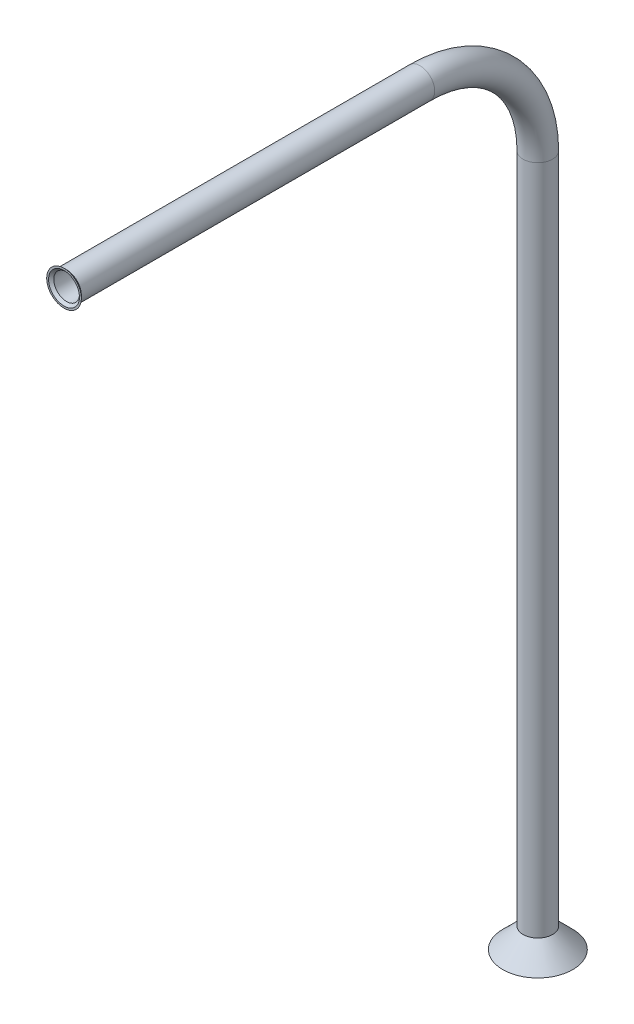
ISO-10303-21;
HEADER;
FILE_DESCRIPTION(('STEP AP214'),'2;1');
FILE_NAME('part.step','',(''),(''),'','','');
FILE_SCHEMA(('AUTOMOTIVE_DESIGN { 1 0 10303 214 1 1 1 1 }'));
ENDSEC;
DATA;
#1=APPLICATION_CONTEXT('core data for automotive mechanical design processes');
#2=APPLICATION_PROTOCOL_DEFINITION('international standard','automotive_design',2000,#1);
#3=PRODUCT_CONTEXT('',#1,'mechanical');
#4=PRODUCT('Part','Part','',(#3));
#5=PRODUCT_RELATED_PRODUCT_CATEGORY('part','',(#4));
#6=PRODUCT_DEFINITION_FORMATION('','',#4);
#7=PRODUCT_DEFINITION_CONTEXT('part definition',#1,'design');
#8=PRODUCT_DEFINITION('design','',#6,#7);
#9=PRODUCT_DEFINITION_SHAPE('','',#8);
#10=(LENGTH_UNIT() NAMED_UNIT(*) SI_UNIT(.MILLI.,.METRE.));
#11=(NAMED_UNIT(*) PLANE_ANGLE_UNIT() SI_UNIT($,.RADIAN.));
#12=(NAMED_UNIT(*) SI_UNIT($,.STERADIAN.) SOLID_ANGLE_UNIT());
#13=UNCERTAINTY_MEASURE_WITH_UNIT(LENGTH_MEASURE(1.E-05),#10,'distance_accuracy_value','');
#14=(GEOMETRIC_REPRESENTATION_CONTEXT(3) GLOBAL_UNCERTAINTY_ASSIGNED_CONTEXT((#13)) GLOBAL_UNIT_ASSIGNED_CONTEXT((#10,
#11,#12)) REPRESENTATION_CONTEXT('',''));
#15=CARTESIAN_POINT('',(0.,0.,0.));
#16=DIRECTION('',(0.,0.,1.));
#17=DIRECTION('',(1.,0.,0.));
#18=AXIS2_PLACEMENT_3D('',#15,#16,#17);
#19=CARTESIAN_POINT('',(0.,0.,0.));
#20=DIRECTION('',(0.,0.,-1.));
#21=DIRECTION('',(-1.,0.,0.));
#22=AXIS2_PLACEMENT_3D('',#19,#20,#21);
#23=CYLINDRICAL_SURFACE('',#22,6.35);
#24=CARTESIAN_POINT('',(0.,0.,-152.4));
#25=DIRECTION('',(0.,0.,1.));
#26=DIRECTION('',(1.,0.,0.));
#27=AXIS2_PLACEMENT_3D('',#24,#25,#26);
#28=CIRCLE('',#27,6.35);
#29=CARTESIAN_POINT('',(0.,6.35000000000002,-152.4));
#30=VERTEX_POINT('',#29);
#31=EDGE_CURVE('E65',#30,#30,#28,.T.);
#32=ORIENTED_EDGE('',*,*,#31,.T.);
#33=EDGE_LOOP('',(#32));
#34=FACE_BOUND('',#33,.T.);
#35=CARTESIAN_POINT('',(0.,0.,0.));
#36=DIRECTION('',(0.,0.,1.));
#37=DIRECTION('',(1.,0.,0.));
#38=AXIS2_PLACEMENT_3D('',#35,#36,#37);
#39=CIRCLE('',#38,6.35);
#40=CARTESIAN_POINT('',(6.35,0.,0.));
#41=VERTEX_POINT('',#40);
#42=EDGE_CURVE('E72',#41,#41,#39,.T.);
#43=ORIENTED_EDGE('',*,*,#42,.F.);
#44=EDGE_LOOP('',(#43));
#45=FACE_BOUND('',#44,.T.);
#46=ADVANCED_FACE('F48',(#34,#45),#23,.T.);
#47=CARTESIAN_POINT('',(0.,-50.8,-152.4));
#48=DIRECTION('',(-1.,0.,0.));
#49=DIRECTION('',(0.,0.,1.));
#50=AXIS2_PLACEMENT_3D('',#47,#48,#49);
#51=TOROIDAL_SURFACE('',#50,50.8,6.35);
#52=CARTESIAN_POINT('',(0.,-50.8,-203.2));
#53=DIRECTION('',(0.,1.,0.));
#54=DIRECTION('',(1.,0.,0.));
#55=AXIS2_PLACEMENT_3D('',#52,#53,#54);
#56=CIRCLE('',#55,6.35);
#57=CARTESIAN_POINT('',(0.,-50.8,-209.55));
#58=VERTEX_POINT('',#57);
#59=EDGE_CURVE('E69',#58,#58,#56,.T.);
#60=CARTESIAN_POINT('',(0.,-50.8,-152.4));
#61=DIRECTION('',(-1.,0.,0.));
#62=DIRECTION('',(0.,0.,1.));
#63=AXIS2_PLACEMENT_3D('',#60,#61,#62);
#64=CIRCLE('',#63,57.15);
#65=EDGE_CURVE('',#30,#58,#64,.T.);
#66=ORIENTED_EDGE('',*,*,#31,.F.);
#67=ORIENTED_EDGE('',*,*,#59,.T.);
#68=ORIENTED_EDGE('',*,*,#65,.T.);
#69=ORIENTED_EDGE('',*,*,#65,.F.);
#70=EDGE_LOOP('',(#66,#68,#67,#69));
#71=FACE_BOUND('',#70,.T.);
#72=ADVANCED_FACE('F93',(#71),#51,.T.);
#73=CARTESIAN_POINT('',(0.,-50.8,-203.2));
#74=DIRECTION('',(0.,-1.,0.));
#75=DIRECTION('',(0.,0.,-1.));
#76=AXIS2_PLACEMENT_3D('',#73,#74,#75);
#77=CYLINDRICAL_SURFACE('',#76,6.35);
#78=CARTESIAN_POINT('',(0.,-340.36,-203.2));
#79=DIRECTION('',(0.,1.,0.));
#80=DIRECTION('',(0.,0.,1.));
#81=AXIS2_PLACEMENT_3D('',#78,#79,#80);
#82=CIRCLE('',#81,6.34999999999999);
#83=CARTESIAN_POINT('',(0.,-340.36,-196.85));
#84=VERTEX_POINT('',#83);
#85=EDGE_CURVE('E192',#84,#84,#82,.T.);
#86=ORIENTED_EDGE('',*,*,#85,.T.);
#87=EDGE_LOOP('',(#86));
#88=FACE_BOUND('',#87,.T.);
#89=ORIENTED_EDGE('',*,*,#59,.F.);
#90=EDGE_LOOP('',(#89));
#91=FACE_BOUND('',#90,.T.);
#92=ADVANCED_FACE('F50',(#88,#91),#77,.T.);
#93=CARTESIAN_POINT('',(0.,0.,0.));
#94=DIRECTION('',(0.,0.,-1.));
#95=DIRECTION('',(-1.,0.,0.));
#96=AXIS2_PLACEMENT_3D('',#93,#94,#95);
#97=CYLINDRICAL_SURFACE('',#96,5.5372);
#98=CARTESIAN_POINT('',(0.,0.,-152.4));
#99=DIRECTION('',(0.,0.,1.));
#100=DIRECTION('',(1.,0.,0.));
#101=AXIS2_PLACEMENT_3D('',#98,#99,#100);
#102=CIRCLE('',#101,5.5372);
#103=CARTESIAN_POINT('',(0.,5.53720000000002,-152.4));
#104=VERTEX_POINT('',#103);
#105=EDGE_CURVE('E56',#104,#104,#102,.F.);
#106=ORIENTED_EDGE('',*,*,#105,.T.);
#107=EDGE_LOOP('',(#106));
#108=FACE_BOUND('',#107,.T.);
#109=CARTESIAN_POINT('',(0.,0.,0.));
#110=DIRECTION('',(0.,0.,1.));
#111=DIRECTION('',(1.,0.,0.));
#112=AXIS2_PLACEMENT_3D('',#109,#110,#111);
#113=CIRCLE('',#112,5.5372);
#114=CARTESIAN_POINT('',(5.5372,0.,0.));
#115=VERTEX_POINT('',#114);
#116=EDGE_CURVE('E52',#115,#115,#113,.F.);
#117=ORIENTED_EDGE('',*,*,#116,.F.);
#118=EDGE_LOOP('',(#117));
#119=FACE_BOUND('',#118,.T.);
#120=ADVANCED_FACE('F82',(#108,#119),#97,.F.);
#121=CARTESIAN_POINT('',(0.,-50.8,-152.4));
#122=DIRECTION('',(-1.,0.,0.));
#123=DIRECTION('',(0.,0.,1.));
#124=AXIS2_PLACEMENT_3D('',#121,#122,#123);
#125=TOROIDAL_SURFACE('',#124,50.8,5.5372);
#126=CARTESIAN_POINT('',(0.,-50.8,-203.2));
#127=DIRECTION('',(0.,1.,0.));
#128=DIRECTION('',(1.,0.,0.));
#129=AXIS2_PLACEMENT_3D('',#126,#127,#128);
#130=CIRCLE('',#129,5.5372);
#131=CARTESIAN_POINT('',(0.,-50.8,-208.7372));
#132=VERTEX_POINT('',#131);
#133=EDGE_CURVE('E12',#132,#132,#130,.F.);
#134=CARTESIAN_POINT('',(0.,-50.8,-152.4));
#135=DIRECTION('',(-1.,0.,0.));
#136=DIRECTION('',(0.,0.,1.));
#137=AXIS2_PLACEMENT_3D('',#134,#135,#136);
#138=CIRCLE('',#137,56.3372);
#139=EDGE_CURVE('',#104,#132,#138,.T.);
#140=ORIENTED_EDGE('',*,*,#105,.F.);
#141=ORIENTED_EDGE('',*,*,#133,.T.);
#142=ORIENTED_EDGE('',*,*,#139,.T.);
#143=ORIENTED_EDGE('',*,*,#139,.F.);
#144=EDGE_LOOP('',(#140,#142,#141,#143));
#145=FACE_BOUND('',#144,.T.);
#146=ADVANCED_FACE('F84',(#145),#125,.F.);
#147=CARTESIAN_POINT('',(0.,-50.8,-203.2));
#148=DIRECTION('',(0.,-1.,0.));
#149=DIRECTION('',(0.,0.,-1.));
#150=AXIS2_PLACEMENT_3D('',#147,#148,#149);
#151=CYLINDRICAL_SURFACE('',#150,5.5372);
#152=CARTESIAN_POINT('',(0.,-340.36,-203.2));
#153=DIRECTION('',(0.,1.,0.));
#154=DIRECTION('',(0.,0.,1.));
#155=AXIS2_PLACEMENT_3D('',#152,#153,#154);
#156=CIRCLE('',#155,5.53719999999999);
#157=CARTESIAN_POINT('',(0.,-340.36,-197.6628));
#158=VERTEX_POINT('',#157);
#159=EDGE_CURVE('E185',#158,#158,#156,.T.);
#160=ORIENTED_EDGE('',*,*,#159,.F.);
#161=EDGE_LOOP('',(#160));
#162=FACE_BOUND('',#161,.T.);
#163=ORIENTED_EDGE('',*,*,#133,.F.);
#164=EDGE_LOOP('',(#163));
#165=FACE_BOUND('',#164,.T.);
#166=ADVANCED_FACE('F91',(#162,#165),#151,.F.);
#167=CARTESIAN_POINT('',(0.,0.,1.12253201513365));
#168=DIRECTION('',(0.,0.,1.));
#169=DIRECTION('',(1.,0.,0.));
#170=AXIS2_PLACEMENT_3D('',#167,#168,#169);
#171=CONICAL_SURFACE('',#170,6.65973201513364,0.785398163397446);
#172=ORIENTED_EDGE('',*,*,#116,.T.);
#173=EDGE_LOOP('',(#172));
#174=FACE_BOUND('',#173,.T.);
#175=CARTESIAN_POINT('',(0.,0.,1.12253201513365));
#176=DIRECTION('',(0.,0.,-1.));
#177=DIRECTION('',(-1.,0.,0.));
#178=AXIS2_PLACEMENT_3D('',#175,#176,#177);
#179=CIRCLE('',#178,6.65973201513364);
#180=CARTESIAN_POINT('',(-6.65973201513364,0.,1.12253201513365));
#181=VERTEX_POINT('',#180);
#182=EDGE_CURVE('E70',#181,#181,#179,.T.);
#183=ORIENTED_EDGE('',*,*,#182,.F.);
#184=EDGE_LOOP('',(#183));
#185=FACE_BOUND('',#184,.T.);
#186=ADVANCED_FACE('F79',(#174,#185),#171,.F.);
#187=CARTESIAN_POINT('',(0.,7.47253201513364,1.12253201513365));
#188=DIRECTION('',(0.,0.,1.));
#189=DIRECTION('',(1.,0.,0.));
#190=AXIS2_PLACEMENT_3D('',#187,#188,#189);
#191=PLANE('',#190);
#192=ORIENTED_EDGE('',*,*,#182,.T.);
#193=EDGE_LOOP('',(#192));
#194=FACE_BOUND('',#193,.T.);
#195=CARTESIAN_POINT('',(0.,0.,1.12253201513365));
#196=DIRECTION('',(0.,0.,-1.));
#197=DIRECTION('',(-1.,0.,0.));
#198=AXIS2_PLACEMENT_3D('',#195,#196,#197);
#199=CIRCLE('',#198,7.47253201513364);
#200=CARTESIAN_POINT('',(-7.47253201513364,0.,1.12253201513365));
#201=VERTEX_POINT('',#200);
#202=EDGE_CURVE('E184',#201,#201,#199,.T.);
#203=ORIENTED_EDGE('',*,*,#202,.F.);
#204=EDGE_LOOP('',(#203));
#205=FACE_BOUND('',#204,.T.);
#206=ADVANCED_FACE('F102',(#194,#205),#191,.T.);
#207=CARTESIAN_POINT('',(0.,0.,0.));
#208=DIRECTION('',(0.,0.,1.));
#209=DIRECTION('',(1.,0.,0.));
#210=AXIS2_PLACEMENT_3D('',#207,#208,#209);
#211=CONICAL_SURFACE('',#210,6.35,0.785398163397448);
#212=ORIENTED_EDGE('',*,*,#202,.T.);
#213=EDGE_LOOP('',(#212));
#214=FACE_BOUND('',#213,.T.);
#215=ORIENTED_EDGE('',*,*,#42,.T.);
#216=EDGE_LOOP('',(#215));
#217=FACE_BOUND('',#216,.T.);
#218=ADVANCED_FACE('F130',(#214,#217),#211,.T.);
#219=CARTESIAN_POINT('',(0.,-349.102532015134,-203.2));
#220=DIRECTION('',(0.,-1.,0.));
#221=DIRECTION('',(0.,0.,-1.));
#222=AXIS2_PLACEMENT_3D('',#219,#220,#221);
#223=CONICAL_SURFACE('',#222,14.279732015134,0.785398163397461);
#224=ORIENTED_EDGE('',*,*,#159,.T.);
#225=EDGE_LOOP('',(#224));
#226=FACE_BOUND('',#225,.T.);
#227=CARTESIAN_POINT('',(0.,-349.102532015134,-203.2));
#228=DIRECTION('',(0.,1.,0.));
#229=DIRECTION('',(0.,0.,1.));
#230=AXIS2_PLACEMENT_3D('',#227,#228,#229);
#231=CIRCLE('',#230,14.279732015134);
#232=CARTESIAN_POINT('',(0.,-349.102532015134,-188.920267984866));
#233=VERTEX_POINT('',#232);
#234=EDGE_CURVE('E189',#233,#233,#231,.T.);
#235=ORIENTED_EDGE('',*,*,#234,.F.);
#236=EDGE_LOOP('',(#235));
#237=FACE_BOUND('',#236,.T.);
#238=ADVANCED_FACE('F142',(#226,#237),#223,.F.);
#239=CARTESIAN_POINT('',(0.,-349.102532015134,-188.107467984866));
#240=DIRECTION('',(0.,-1.,0.));
#241=DIRECTION('',(0.,0.,-1.));
#242=AXIS2_PLACEMENT_3D('',#239,#240,#241);
#243=PLANE('',#242);
#244=ORIENTED_EDGE('',*,*,#234,.T.);
#245=EDGE_LOOP('',(#244));
#246=FACE_BOUND('',#245,.T.);
#247=CARTESIAN_POINT('',(0.,-349.102532015134,-203.2));
#248=DIRECTION('',(0.,1.,0.));
#249=DIRECTION('',(0.,0.,1.));
#250=AXIS2_PLACEMENT_3D('',#247,#248,#249);
#251=CIRCLE('',#250,15.0925320151339);
#252=CARTESIAN_POINT('',(0.,-349.102532015134,-188.107467984866));
#253=VERTEX_POINT('',#252);
#254=EDGE_CURVE('E196',#253,#253,#251,.T.);
#255=ORIENTED_EDGE('',*,*,#254,.F.);
#256=EDGE_LOOP('',(#255));
#257=FACE_BOUND('',#256,.T.);
#258=ADVANCED_FACE('F147',(#246,#257),#243,.T.);
#259=CARTESIAN_POINT('',(0.,-340.36,-203.2));
#260=DIRECTION('',(0.,-1.,0.));
#261=DIRECTION('',(0.,0.,-1.));
#262=AXIS2_PLACEMENT_3D('',#259,#260,#261);
#263=CONICAL_SURFACE('',#262,6.34999999999999,0.785398163397459);
#264=ORIENTED_EDGE('',*,*,#254,.T.);
#265=EDGE_LOOP('',(#264));
#266=FACE_BOUND('',#265,.T.);
#267=ORIENTED_EDGE('',*,*,#85,.F.);
#268=EDGE_LOOP('',(#267));
#269=FACE_BOUND('',#268,.T.);
#270=ADVANCED_FACE('F157',(#266,#269),#263,.T.);
#271=CLOSED_SHELL('',(#46,#72,#92,#120,#146,#166,#186,#206,#218,#238,#258,#270));
#272=MANIFOLD_SOLID_BREP('B2',#271);
#273=ADVANCED_BREP_SHAPE_REPRESENTATION('',(#18,#272),#14);
#274=SHAPE_DEFINITION_REPRESENTATION(#9,#273);
ENDSEC;
END-ISO-10303-21;
